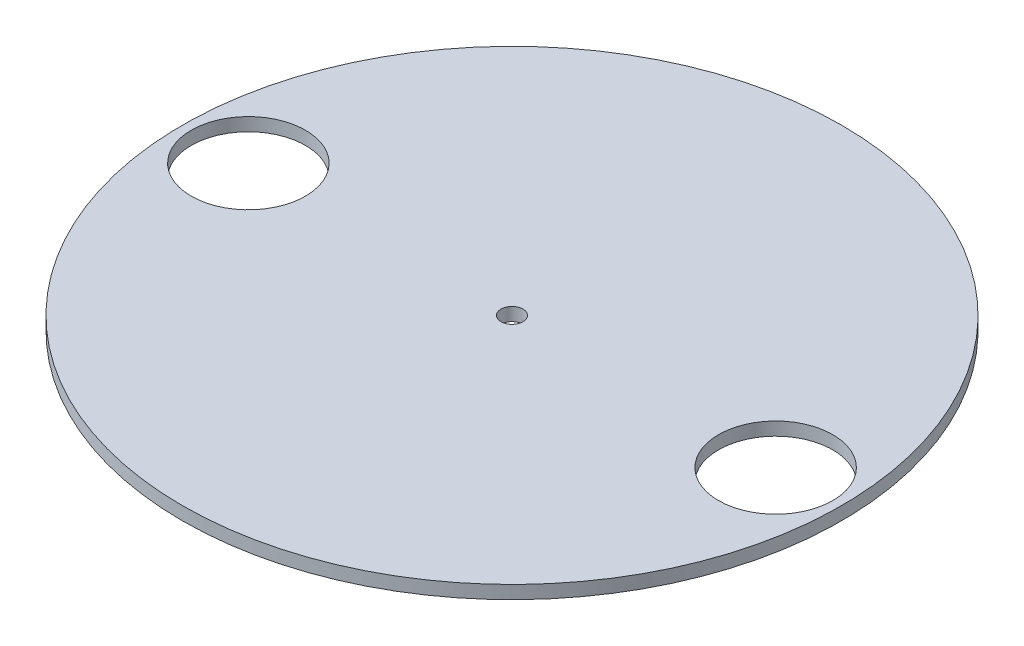
ISO-10303-21;
HEADER;
FILE_DESCRIPTION(('STEP AP214'),'2;1');
FILE_NAME('part.step','',(''),(''),'','','');
FILE_SCHEMA(('AUTOMOTIVE_DESIGN { 1 0 10303 214 1 1 1 1 }'));
ENDSEC;
DATA;
#1=APPLICATION_CONTEXT('core data for automotive mechanical design processes');
#2=APPLICATION_PROTOCOL_DEFINITION('international standard','automotive_design',2000,#1);
#3=PRODUCT_CONTEXT('',#1,'mechanical');
#4=PRODUCT('Part','Part','',(#3));
#5=PRODUCT_RELATED_PRODUCT_CATEGORY('part','',(#4));
#6=PRODUCT_DEFINITION_FORMATION('','',#4);
#7=PRODUCT_DEFINITION_CONTEXT('part definition',#1,'design');
#8=PRODUCT_DEFINITION('design','',#6,#7);
#9=PRODUCT_DEFINITION_SHAPE('','',#8);
#10=(LENGTH_UNIT() NAMED_UNIT(*) SI_UNIT(.MILLI.,.METRE.));
#11=(NAMED_UNIT(*) PLANE_ANGLE_UNIT() SI_UNIT($,.RADIAN.));
#12=(NAMED_UNIT(*) SI_UNIT($,.STERADIAN.) SOLID_ANGLE_UNIT());
#13=UNCERTAINTY_MEASURE_WITH_UNIT(LENGTH_MEASURE(1.E-05),#10,'distance_accuracy_value','');
#14=(GEOMETRIC_REPRESENTATION_CONTEXT(3) GLOBAL_UNCERTAINTY_ASSIGNED_CONTEXT((#13)) GLOBAL_UNIT_ASSIGNED_CONTEXT((#10,
#11,#12)) REPRESENTATION_CONTEXT('',''));
#15=CARTESIAN_POINT('',(0.,0.,0.));
#16=DIRECTION('',(0.,0.,1.));
#17=DIRECTION('',(1.,0.,0.));
#18=AXIS2_PLACEMENT_3D('',#15,#16,#17);
#19=CARTESIAN_POINT('',(60.,3.,0.));
#20=DIRECTION('',(0.,-1.,0.));
#21=DIRECTION('',(0.,0.,-1.));
#22=AXIS2_PLACEMENT_3D('',#19,#20,#21);
#23=CYLINDRICAL_SURFACE('',#22,13.);
#24=CARTESIAN_POINT('',(60.,3.,0.));
#25=DIRECTION('',(0.,1.,0.));
#26=DIRECTION('',(0.,0.,1.));
#27=AXIS2_PLACEMENT_3D('',#24,#25,#26);
#28=CIRCLE('',#27,13.);
#29=CARTESIAN_POINT('',(60.,3.,13.));
#30=VERTEX_POINT('',#29);
#31=EDGE_CURVE('E41',#30,#30,#28,.T.);
#32=ORIENTED_EDGE('',*,*,#31,.T.);
#33=EDGE_LOOP('',(#32));
#34=FACE_BOUND('',#33,.T.);
#35=CARTESIAN_POINT('',(60.,0.,0.));
#36=DIRECTION('',(0.,1.,0.));
#37=DIRECTION('',(0.,0.,1.));
#38=AXIS2_PLACEMENT_3D('',#35,#36,#37);
#39=CIRCLE('',#38,13.);
#40=CARTESIAN_POINT('',(60.,0.,13.));
#41=VERTEX_POINT('',#40);
#42=EDGE_CURVE('E55',#41,#41,#39,.T.);
#43=ORIENTED_EDGE('',*,*,#42,.F.);
#44=EDGE_LOOP('',(#43));
#45=FACE_BOUND('',#44,.T.);
#46=ADVANCED_FACE('F33',(#34,#45),#23,.F.);
#47=CARTESIAN_POINT('',(-60.,3.,0.));
#48=DIRECTION('',(0.,-1.,0.));
#49=DIRECTION('',(0.,0.,-1.));
#50=AXIS2_PLACEMENT_3D('',#47,#48,#49);
#51=CYLINDRICAL_SURFACE('',#50,13.);
#52=CARTESIAN_POINT('',(-60.,3.,0.));
#53=DIRECTION('',(0.,1.,0.));
#54=DIRECTION('',(0.,0.,1.));
#55=AXIS2_PLACEMENT_3D('',#52,#53,#54);
#56=CIRCLE('',#55,13.);
#57=CARTESIAN_POINT('',(-60.,3.,13.));
#58=VERTEX_POINT('',#57);
#59=EDGE_CURVE('E46',#58,#58,#56,.T.);
#60=ORIENTED_EDGE('',*,*,#59,.T.);
#61=EDGE_LOOP('',(#60));
#62=FACE_BOUND('',#61,.T.);
#63=CARTESIAN_POINT('',(-60.,0.,0.));
#64=DIRECTION('',(0.,1.,0.));
#65=DIRECTION('',(0.,0.,1.));
#66=AXIS2_PLACEMENT_3D('',#63,#64,#65);
#67=CIRCLE('',#66,13.);
#68=CARTESIAN_POINT('',(-60.,0.,13.));
#69=VERTEX_POINT('',#68);
#70=EDGE_CURVE('E53',#69,#69,#67,.T.);
#71=ORIENTED_EDGE('',*,*,#70,.F.);
#72=EDGE_LOOP('',(#71));
#73=FACE_BOUND('',#72,.T.);
#74=ADVANCED_FACE('F70',(#62,#73),#51,.F.);
#75=CARTESIAN_POINT('',(0.,3.,0.));
#76=DIRECTION('',(0.,-1.,0.));
#77=DIRECTION('',(0.,0.,-1.));
#78=AXIS2_PLACEMENT_3D('',#75,#76,#77);
#79=CYLINDRICAL_SURFACE('',#78,2.5);
#80=CARTESIAN_POINT('',(0.,3.,0.));
#81=DIRECTION('',(0.,1.,0.));
#82=DIRECTION('',(0.,0.,1.));
#83=AXIS2_PLACEMENT_3D('',#80,#81,#82);
#84=CIRCLE('',#83,2.5);
#85=CARTESIAN_POINT('',(0.,3.,2.5));
#86=VERTEX_POINT('',#85);
#87=EDGE_CURVE('E60',#86,#86,#84,.T.);
#88=ORIENTED_EDGE('',*,*,#87,.T.);
#89=EDGE_LOOP('',(#88));
#90=FACE_BOUND('',#89,.T.);
#91=CARTESIAN_POINT('',(0.,0.,0.));
#92=DIRECTION('',(0.,1.,0.));
#93=DIRECTION('',(0.,0.,1.));
#94=AXIS2_PLACEMENT_3D('',#91,#92,#93);
#95=CIRCLE('',#94,2.5);
#96=CARTESIAN_POINT('',(0.,0.,2.5));
#97=VERTEX_POINT('',#96);
#98=EDGE_CURVE('E50',#97,#97,#95,.T.);
#99=ORIENTED_EDGE('',*,*,#98,.F.);
#100=EDGE_LOOP('',(#99));
#101=FACE_BOUND('',#100,.T.);
#102=ADVANCED_FACE('F35',(#90,#101),#79,.F.);
#103=CARTESIAN_POINT('',(0.,3.,0.));
#104=DIRECTION('',(0.,-1.,0.));
#105=DIRECTION('',(0.,0.,-1.));
#106=AXIS2_PLACEMENT_3D('',#103,#104,#105);
#107=CYLINDRICAL_SURFACE('',#106,75.);
#108=CARTESIAN_POINT('',(0.,3.,0.));
#109=DIRECTION('',(0.,1.,0.));
#110=DIRECTION('',(0.,0.,1.));
#111=AXIS2_PLACEMENT_3D('',#108,#109,#110);
#112=CIRCLE('',#111,75.);
#113=CARTESIAN_POINT('',(0.,3.,75.));
#114=VERTEX_POINT('',#113);
#115=EDGE_CURVE('E10',#114,#114,#112,.T.);
#116=ORIENTED_EDGE('',*,*,#115,.F.);
#117=EDGE_LOOP('',(#116));
#118=FACE_BOUND('',#117,.T.);
#119=CARTESIAN_POINT('',(0.,0.,0.));
#120=DIRECTION('',(0.,1.,0.));
#121=DIRECTION('',(0.,0.,1.));
#122=AXIS2_PLACEMENT_3D('',#119,#120,#121);
#123=CIRCLE('',#122,75.);
#124=CARTESIAN_POINT('',(0.,0.,75.));
#125=VERTEX_POINT('',#124);
#126=EDGE_CURVE('E37',#125,#125,#123,.T.);
#127=ORIENTED_EDGE('',*,*,#126,.T.);
#128=EDGE_LOOP('',(#127));
#129=FACE_BOUND('',#128,.T.);
#130=ADVANCED_FACE('F77',(#118,#129),#107,.T.);
#131=CARTESIAN_POINT('',(0.,3.,0.));
#132=DIRECTION('',(0.,1.,0.));
#133=DIRECTION('',(0.,0.,1.));
#134=AXIS2_PLACEMENT_3D('',#131,#132,#133);
#135=PLANE('',#134);
#136=ORIENTED_EDGE('',*,*,#87,.F.);
#137=EDGE_LOOP('',(#136));
#138=FACE_BOUND('',#137,.T.);
#139=ORIENTED_EDGE('',*,*,#59,.F.);
#140=EDGE_LOOP('',(#139));
#141=FACE_BOUND('',#140,.T.);
#142=ORIENTED_EDGE('',*,*,#31,.F.);
#143=EDGE_LOOP('',(#142));
#144=FACE_BOUND('',#143,.T.);
#145=ORIENTED_EDGE('',*,*,#115,.T.);
#146=EDGE_LOOP('',(#145));
#147=FACE_BOUND('',#146,.T.);
#148=ADVANCED_FACE('F73',(#138,#141,#144,#147),#135,.T.);
#149=CARTESIAN_POINT('',(0.,0.,0.));
#150=DIRECTION('',(0.,1.,0.));
#151=DIRECTION('',(0.,0.,1.));
#152=AXIS2_PLACEMENT_3D('',#149,#150,#151);
#153=PLANE('',#152);
#154=ORIENTED_EDGE('',*,*,#98,.T.);
#155=EDGE_LOOP('',(#154));
#156=FACE_BOUND('',#155,.T.);
#157=ORIENTED_EDGE('',*,*,#70,.T.);
#158=EDGE_LOOP('',(#157));
#159=FACE_BOUND('',#158,.T.);
#160=ORIENTED_EDGE('',*,*,#42,.T.);
#161=EDGE_LOOP('',(#160));
#162=FACE_BOUND('',#161,.T.);
#163=ORIENTED_EDGE('',*,*,#126,.F.);
#164=EDGE_LOOP('',(#163));
#165=FACE_BOUND('',#164,.T.);
#166=ADVANCED_FACE('F76',(#156,#159,#162,#165),#153,.F.);
#167=CLOSED_SHELL('',(#46,#74,#102,#130,#148,#166));
#168=MANIFOLD_SOLID_BREP('B2',#167);
#169=ADVANCED_BREP_SHAPE_REPRESENTATION('',(#18,#168),#14);
#170=SHAPE_DEFINITION_REPRESENTATION(#9,#169);
ENDSEC;
END-ISO-10303-21;
